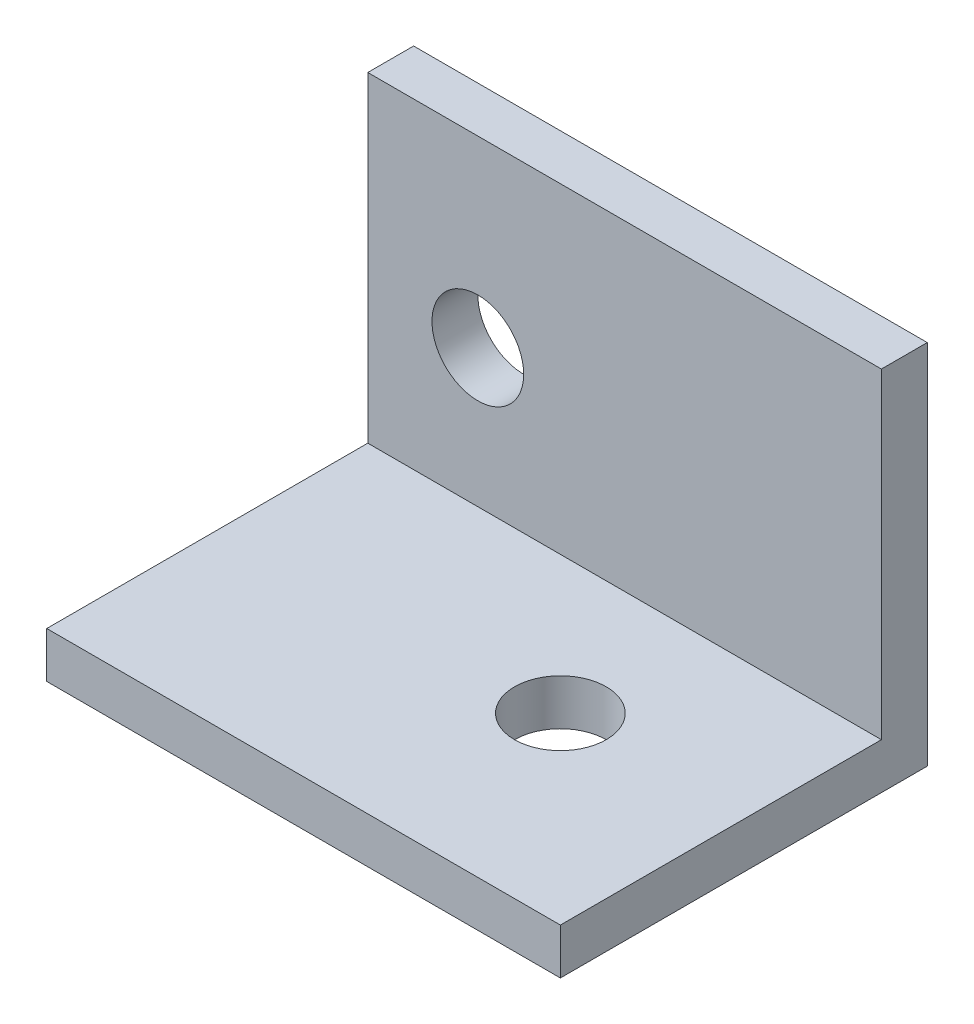
ISO-10303-21;
HEADER;
FILE_DESCRIPTION(('STEP AP214'),'2;1');
FILE_NAME('part.step','',(''),(''),'','','');
FILE_SCHEMA(('AUTOMOTIVE_DESIGN { 1 0 10303 214 1 1 1 1 }'));
ENDSEC;
DATA;
#1=APPLICATION_CONTEXT('core data for automotive mechanical design processes');
#2=APPLICATION_PROTOCOL_DEFINITION('international standard','automotive_design',2000,#1);
#3=PRODUCT_CONTEXT('',#1,'mechanical');
#4=PRODUCT('Part','Part','',(#3));
#5=PRODUCT_RELATED_PRODUCT_CATEGORY('part','',(#4));
#6=PRODUCT_DEFINITION_FORMATION('','',#4);
#7=PRODUCT_DEFINITION_CONTEXT('part definition',#1,'design');
#8=PRODUCT_DEFINITION('design','',#6,#7);
#9=PRODUCT_DEFINITION_SHAPE('','',#8);
#10=(LENGTH_UNIT() NAMED_UNIT(*) SI_UNIT(.MILLI.,.METRE.));
#11=(NAMED_UNIT(*) PLANE_ANGLE_UNIT() SI_UNIT($,.RADIAN.));
#12=(NAMED_UNIT(*) SI_UNIT($,.STERADIAN.) SOLID_ANGLE_UNIT());
#13=UNCERTAINTY_MEASURE_WITH_UNIT(LENGTH_MEASURE(1.E-05),#10,'distance_accuracy_value','');
#14=(GEOMETRIC_REPRESENTATION_CONTEXT(3) GLOBAL_UNCERTAINTY_ASSIGNED_CONTEXT((#13)) GLOBAL_UNIT_ASSIGNED_CONTEXT((#10,
#11,#12)) REPRESENTATION_CONTEXT('',''));
#15=CARTESIAN_POINT('',(0.,0.,0.));
#16=DIRECTION('',(0.,0.,1.));
#17=DIRECTION('',(1.,0.,0.));
#18=AXIS2_PLACEMENT_3D('',#15,#16,#17);
#19=CARTESIAN_POINT('',(0.,3.175,0.));
#20=DIRECTION('',(0.,-1.,0.));
#21=DIRECTION('',(0.,0.,-1.));
#22=AXIS2_PLACEMENT_3D('',#19,#20,#21);
#23=PLANE('',#22);
#24=CARTESIAN_POINT('',(5.07999999999999,3.175,0.));
#25=DIRECTION('',(0.,1.,0.));
#26=DIRECTION('',(0.,0.,1.));
#27=AXIS2_PLACEMENT_3D('',#24,#25,#26);
#28=CIRCLE('',#27,3.175);
#29=CARTESIAN_POINT('',(5.07999999999999,3.175,3.175));
#30=VERTEX_POINT('',#29);
#31=EDGE_CURVE('E185',#30,#30,#28,.T.);
#32=ORIENTED_EDGE('',*,*,#31,.F.);
#33=EDGE_LOOP('',(#32));
#34=FACE_BOUND('',#33,.T.);
#35=DIRECTION('',(1.,0.,0.));
#36=VECTOR('',#35,1.);
#37=CARTESIAN_POINT('',(17.78,3.175,-9.525));
#38=LINE('',#37,#36);
#39=CARTESIAN_POINT('',(-17.78,3.175,-9.525));
#40=VERTEX_POINT('',#39);
#41=CARTESIAN_POINT('',(17.78,3.175,-9.525));
#42=VERTEX_POINT('',#41);
#43=EDGE_CURVE('E54',#40,#42,#38,.T.);
#44=ORIENTED_EDGE('',*,*,#43,.F.);
#45=DIRECTION('',(0.,0.,1.));
#46=VECTOR('',#45,1.);
#47=CARTESIAN_POINT('',(-17.78,3.175,12.7));
#48=LINE('',#47,#46);
#49=CARTESIAN_POINT('',(-17.78,3.175,12.7));
#50=VERTEX_POINT('',#49);
#51=EDGE_CURVE('E143',#40,#50,#48,.T.);
#52=ORIENTED_EDGE('',*,*,#51,.T.);
#53=DIRECTION('',(1.,0.,0.));
#54=VECTOR('',#53,1.);
#55=CARTESIAN_POINT('',(-17.78,3.175,12.7));
#56=LINE('',#55,#54);
#57=CARTESIAN_POINT('',(17.78,3.175,12.7));
#58=VERTEX_POINT('',#57);
#59=EDGE_CURVE('E60',#50,#58,#56,.T.);
#60=ORIENTED_EDGE('',*,*,#59,.T.);
#61=DIRECTION('',(0.,0.,-1.));
#62=VECTOR('',#61,1.);
#63=CARTESIAN_POINT('',(17.78,3.175,12.7));
#64=LINE('',#63,#62);
#65=EDGE_CURVE('E89',#58,#42,#64,.T.);
#66=ORIENTED_EDGE('',*,*,#65,.T.);
#67=EDGE_LOOP('',(#44,#52,#60,#66));
#68=FACE_BOUND('',#67,.T.);
#69=ADVANCED_FACE('F39',(#34,#68),#23,.F.);
#70=CARTESIAN_POINT('',(17.78,3.175,12.7));
#71=DIRECTION('',(-1.,0.,0.));
#72=DIRECTION('',(0.,0.,1.));
#73=AXIS2_PLACEMENT_3D('',#70,#71,#72);
#74=PLANE('',#73);
#75=DIRECTION('',(0.,0.,-1.));
#76=VECTOR('',#75,1.);
#77=CARTESIAN_POINT('',(17.78,0.,12.7));
#78=LINE('',#77,#76);
#79=CARTESIAN_POINT('',(17.78,0.,12.7));
#80=VERTEX_POINT('',#79);
#81=CARTESIAN_POINT('',(17.78,0.,-12.7));
#82=VERTEX_POINT('',#81);
#83=EDGE_CURVE('E95',#80,#82,#78,.T.);
#84=ORIENTED_EDGE('',*,*,#83,.T.);
#85=DIRECTION('',(0.,-1.,0.));
#86=VECTOR('',#85,1.);
#87=CARTESIAN_POINT('',(17.78,3.175,-12.7));
#88=LINE('',#87,#86);
#89=CARTESIAN_POINT('',(17.78,25.4,-12.7));
#90=VERTEX_POINT('',#89);
#91=EDGE_CURVE('E11',#90,#82,#88,.T.);
#92=ORIENTED_EDGE('',*,*,#91,.F.);
#93=DIRECTION('',(0.,0.,-1.));
#94=VECTOR('',#93,1.);
#95=CARTESIAN_POINT('',(17.78,25.4,-12.7));
#96=LINE('',#95,#94);
#97=CARTESIAN_POINT('',(17.78,25.4,-9.525));
#98=VERTEX_POINT('',#97);
#99=EDGE_CURVE('E132',#98,#90,#96,.T.);
#100=ORIENTED_EDGE('',*,*,#99,.F.);
#101=DIRECTION('',(0.,-1.,0.));
#102=VECTOR('',#101,1.);
#103=CARTESIAN_POINT('',(17.78,25.4,-9.525));
#104=LINE('',#103,#102);
#105=EDGE_CURVE('E104',#98,#42,#104,.T.);
#106=ORIENTED_EDGE('',*,*,#105,.T.);
#107=ORIENTED_EDGE('',*,*,#65,.F.);
#108=DIRECTION('',(0.,-1.,0.));
#109=VECTOR('',#108,1.);
#110=CARTESIAN_POINT('',(17.78,3.175,12.7));
#111=LINE('',#110,#109);
#112=EDGE_CURVE('E82',#58,#80,#111,.T.);
#113=ORIENTED_EDGE('',*,*,#112,.T.);
#114=EDGE_LOOP('',(#84,#92,#100,#106,#107,#113));
#115=FACE_BOUND('',#114,.T.);
#116=ADVANCED_FACE('F41',(#115),#74,.F.);
#117=CARTESIAN_POINT('',(-17.78,3.175,-12.7));
#118=DIRECTION('',(0.,0.,1.));
#119=DIRECTION('',(1.,0.,0.));
#120=AXIS2_PLACEMENT_3D('',#117,#118,#119);
#121=PLANE('',#120);
#122=CARTESIAN_POINT('',(-10.16,12.7,-12.7));
#123=DIRECTION('',(0.,0.,1.));
#124=DIRECTION('',(1.,0.,0.));
#125=AXIS2_PLACEMENT_3D('',#122,#123,#124);
#126=CIRCLE('',#125,3.175);
#127=CARTESIAN_POINT('',(-6.985,12.7,-12.7));
#128=VERTEX_POINT('',#127);
#129=EDGE_CURVE('E183',#128,#128,#126,.T.);
#130=ORIENTED_EDGE('',*,*,#129,.T.);
#131=EDGE_LOOP('',(#130));
#132=FACE_BOUND('',#131,.T.);
#133=DIRECTION('',(-1.,0.,0.));
#134=VECTOR('',#133,1.);
#135=CARTESIAN_POINT('',(-17.78,0.,-12.7));
#136=LINE('',#135,#134);
#137=CARTESIAN_POINT('',(-17.78,0.,-12.7));
#138=VERTEX_POINT('',#137);
#139=EDGE_CURVE('E99',#82,#138,#136,.T.);
#140=ORIENTED_EDGE('',*,*,#139,.T.);
#141=DIRECTION('',(0.,-1.,0.));
#142=VECTOR('',#141,1.);
#143=CARTESIAN_POINT('',(-17.78,3.175,-12.7));
#144=LINE('',#143,#142);
#145=CARTESIAN_POINT('',(-17.78,25.4,-12.7));
#146=VERTEX_POINT('',#145);
#147=EDGE_CURVE('E47',#146,#138,#144,.T.);
#148=ORIENTED_EDGE('',*,*,#147,.F.);
#149=DIRECTION('',(-1.,0.,0.));
#150=VECTOR('',#149,1.);
#151=CARTESIAN_POINT('',(17.78,25.4,-12.7));
#152=LINE('',#151,#150);
#153=EDGE_CURVE('E124',#90,#146,#152,.T.);
#154=ORIENTED_EDGE('',*,*,#153,.F.);
#155=ORIENTED_EDGE('',*,*,#91,.T.);
#156=EDGE_LOOP('',(#140,#148,#154,#155));
#157=FACE_BOUND('',#156,.T.);
#158=ADVANCED_FACE('F122',(#132,#157),#121,.F.);
#159=CARTESIAN_POINT('',(-17.78,3.175,12.7));
#160=DIRECTION('',(1.,0.,0.));
#161=DIRECTION('',(0.,0.,-1.));
#162=AXIS2_PLACEMENT_3D('',#159,#160,#161);
#163=PLANE('',#162);
#164=DIRECTION('',(0.,0.,1.));
#165=VECTOR('',#164,1.);
#166=CARTESIAN_POINT('',(-17.78,0.,12.7));
#167=LINE('',#166,#165);
#168=CARTESIAN_POINT('',(-17.78,0.,12.7));
#169=VERTEX_POINT('',#168);
#170=EDGE_CURVE('E90',#138,#169,#167,.T.);
#171=ORIENTED_EDGE('',*,*,#170,.T.);
#172=DIRECTION('',(0.,-1.,0.));
#173=VECTOR('',#172,1.);
#174=CARTESIAN_POINT('',(-17.78,3.175,12.7));
#175=LINE('',#174,#173);
#176=EDGE_CURVE('E85',#50,#169,#175,.T.);
#177=ORIENTED_EDGE('',*,*,#176,.F.);
#178=ORIENTED_EDGE('',*,*,#51,.F.);
#179=DIRECTION('',(0.,-1.,0.));
#180=VECTOR('',#179,1.);
#181=CARTESIAN_POINT('',(-17.78,25.4,-9.525));
#182=LINE('',#181,#180);
#183=CARTESIAN_POINT('',(-17.78,25.4,-9.525));
#184=VERTEX_POINT('',#183);
#185=EDGE_CURVE('E100',#184,#40,#182,.T.);
#186=ORIENTED_EDGE('',*,*,#185,.F.);
#187=DIRECTION('',(0.,0.,1.));
#188=VECTOR('',#187,1.);
#189=CARTESIAN_POINT('',(-17.78,25.4,-12.7));
#190=LINE('',#189,#188);
#191=EDGE_CURVE('E118',#146,#184,#190,.T.);
#192=ORIENTED_EDGE('',*,*,#191,.F.);
#193=ORIENTED_EDGE('',*,*,#147,.T.);
#194=EDGE_LOOP('',(#171,#177,#178,#186,#192,#193));
#195=FACE_BOUND('',#194,.T.);
#196=ADVANCED_FACE('F114',(#195),#163,.F.);
#197=CARTESIAN_POINT('',(-17.78,3.175,12.7));
#198=DIRECTION('',(0.,0.,-1.));
#199=DIRECTION('',(-1.,0.,0.));
#200=AXIS2_PLACEMENT_3D('',#197,#198,#199);
#201=PLANE('',#200);
#202=DIRECTION('',(1.,0.,0.));
#203=VECTOR('',#202,1.);
#204=CARTESIAN_POINT('',(-17.78,0.,12.7));
#205=LINE('',#204,#203);
#206=EDGE_CURVE('E79',#169,#80,#205,.T.);
#207=ORIENTED_EDGE('',*,*,#206,.T.);
#208=ORIENTED_EDGE('',*,*,#112,.F.);
#209=ORIENTED_EDGE('',*,*,#59,.F.);
#210=ORIENTED_EDGE('',*,*,#176,.T.);
#211=EDGE_LOOP('',(#207,#208,#209,#210));
#212=FACE_BOUND('',#211,.T.);
#213=ADVANCED_FACE('F81',(#212),#201,.F.);
#214=CARTESIAN_POINT('',(0.,0.,0.));
#215=DIRECTION('',(0.,-1.,0.));
#216=DIRECTION('',(0.,0.,-1.));
#217=AXIS2_PLACEMENT_3D('',#214,#215,#216);
#218=PLANE('',#217);
#219=CARTESIAN_POINT('',(5.07999999999999,0.,0.));
#220=DIRECTION('',(0.,1.,0.));
#221=DIRECTION('',(0.,0.,1.));
#222=AXIS2_PLACEMENT_3D('',#219,#220,#221);
#223=CIRCLE('',#222,3.175);
#224=CARTESIAN_POINT('',(5.07999999999999,0.,3.175));
#225=VERTEX_POINT('',#224);
#226=EDGE_CURVE('E141',#225,#225,#223,.T.);
#227=ORIENTED_EDGE('',*,*,#226,.T.);
#228=EDGE_LOOP('',(#227));
#229=FACE_BOUND('',#228,.T.);
#230=ORIENTED_EDGE('',*,*,#83,.F.);
#231=ORIENTED_EDGE('',*,*,#206,.F.);
#232=ORIENTED_EDGE('',*,*,#170,.F.);
#233=ORIENTED_EDGE('',*,*,#139,.F.);
#234=EDGE_LOOP('',(#230,#231,#232,#233));
#235=FACE_BOUND('',#234,.T.);
#236=ADVANCED_FACE('F98',(#229,#235),#218,.T.);
#237=CARTESIAN_POINT('',(17.78,25.4,-9.525));
#238=DIRECTION('',(0.,0.,-1.));
#239=DIRECTION('',(-1.,0.,0.));
#240=AXIS2_PLACEMENT_3D('',#237,#238,#239);
#241=PLANE('',#240);
#242=CARTESIAN_POINT('',(-10.16,12.7,-9.525));
#243=DIRECTION('',(0.,0.,1.));
#244=DIRECTION('',(1.,0.,0.));
#245=AXIS2_PLACEMENT_3D('',#242,#243,#244);
#246=CIRCLE('',#245,3.175);
#247=CARTESIAN_POINT('',(-6.985,12.7,-9.525));
#248=VERTEX_POINT('',#247);
#249=EDGE_CURVE('E186',#248,#248,#246,.T.);
#250=ORIENTED_EDGE('',*,*,#249,.F.);
#251=EDGE_LOOP('',(#250));
#252=FACE_BOUND('',#251,.T.);
#253=ORIENTED_EDGE('',*,*,#43,.T.);
#254=ORIENTED_EDGE('',*,*,#105,.F.);
#255=DIRECTION('',(1.,0.,0.));
#256=VECTOR('',#255,1.);
#257=CARTESIAN_POINT('',(17.78,25.4,-9.525));
#258=LINE('',#257,#256);
#259=EDGE_CURVE('E134',#184,#98,#258,.T.);
#260=ORIENTED_EDGE('',*,*,#259,.F.);
#261=ORIENTED_EDGE('',*,*,#185,.T.);
#262=EDGE_LOOP('',(#253,#254,#260,#261));
#263=FACE_BOUND('',#262,.T.);
#264=ADVANCED_FACE('F146',(#252,#263),#241,.F.);
#265=CARTESIAN_POINT('',(0.,25.4,0.));
#266=DIRECTION('',(0.,-1.,0.));
#267=DIRECTION('',(0.,0.,-1.));
#268=AXIS2_PLACEMENT_3D('',#265,#266,#267);
#269=PLANE('',#268);
#270=ORIENTED_EDGE('',*,*,#99,.T.);
#271=ORIENTED_EDGE('',*,*,#153,.T.);
#272=ORIENTED_EDGE('',*,*,#191,.T.);
#273=ORIENTED_EDGE('',*,*,#259,.T.);
#274=EDGE_LOOP('',(#270,#271,#272,#273));
#275=FACE_BOUND('',#274,.T.);
#276=ADVANCED_FACE('F129',(#275),#269,.F.);
#277=CARTESIAN_POINT('',(5.07999999999999,0.,0.));
#278=DIRECTION('',(0.,1.,0.));
#279=DIRECTION('',(0.,0.,1.));
#280=AXIS2_PLACEMENT_3D('',#277,#278,#279);
#281=CYLINDRICAL_SURFACE('',#280,3.175);
#282=ORIENTED_EDGE('',*,*,#226,.F.);
#283=EDGE_LOOP('',(#282));
#284=FACE_BOUND('',#283,.T.);
#285=ORIENTED_EDGE('',*,*,#31,.T.);
#286=EDGE_LOOP('',(#285));
#287=FACE_BOUND('',#286,.T.);
#288=ADVANCED_FACE('F160',(#284,#287),#281,.F.);
#289=CARTESIAN_POINT('',(-10.16,12.7,-12.7));
#290=DIRECTION('',(0.,0.,1.));
#291=DIRECTION('',(1.,0.,0.));
#292=AXIS2_PLACEMENT_3D('',#289,#290,#291);
#293=CYLINDRICAL_SURFACE('',#292,3.175);
#294=ORIENTED_EDGE('',*,*,#129,.F.);
#295=EDGE_LOOP('',(#294));
#296=FACE_BOUND('',#295,.T.);
#297=ORIENTED_EDGE('',*,*,#249,.T.);
#298=EDGE_LOOP('',(#297));
#299=FACE_BOUND('',#298,.T.);
#300=ADVANCED_FACE('F196',(#296,#299),#293,.F.);
#301=CLOSED_SHELL('',(#69,#116,#158,#196,#213,#236,#264,#276,#288,#300));
#302=MANIFOLD_SOLID_BREP('B2',#301);
#303=ADVANCED_BREP_SHAPE_REPRESENTATION('',(#18,#302),#14);
#304=SHAPE_DEFINITION_REPRESENTATION(#9,#303);
ENDSEC;
END-ISO-10303-21;
